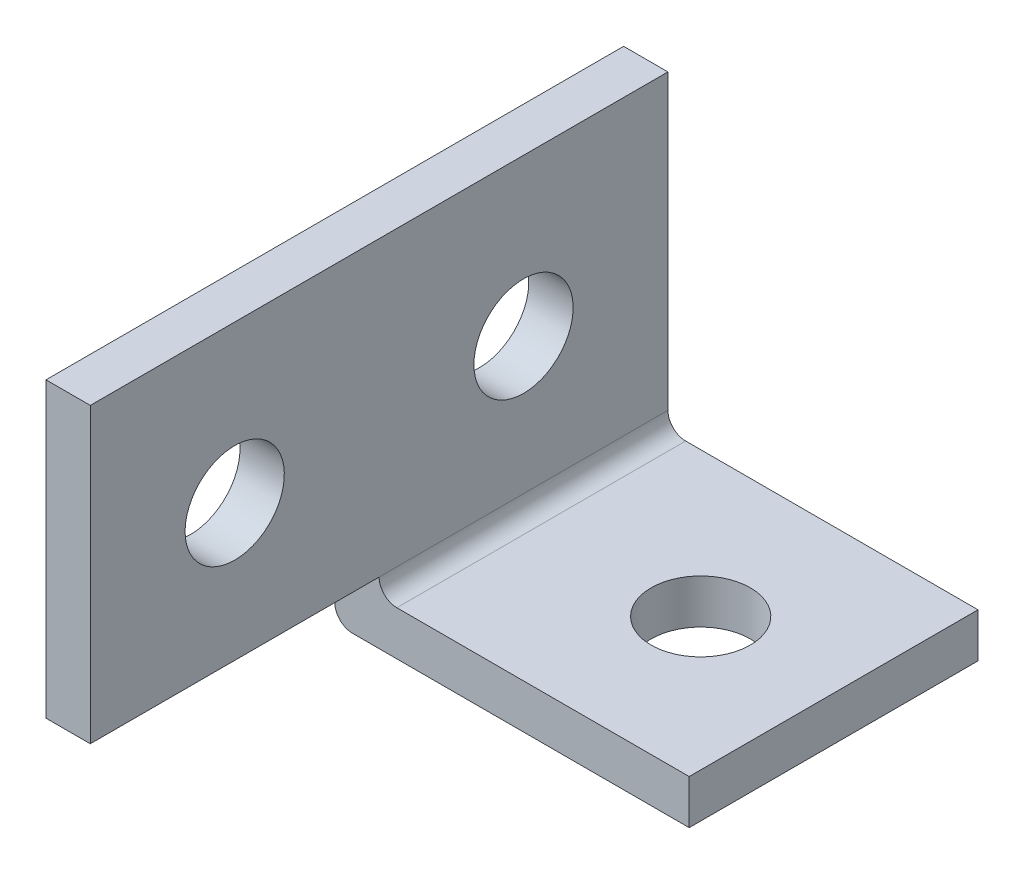
ISO-10303-21;
HEADER;
FILE_DESCRIPTION(('STEP AP214'),'2;1');
FILE_NAME('part.step','',(''),(''),'','','');
FILE_SCHEMA(('AUTOMOTIVE_DESIGN { 1 0 10303 214 1 1 1 1 }'));
ENDSEC;
DATA;
#1=APPLICATION_CONTEXT('core data for automotive mechanical design processes');
#2=APPLICATION_PROTOCOL_DEFINITION('international standard','automotive_design',2000,#1);
#3=PRODUCT_CONTEXT('',#1,'mechanical');
#4=PRODUCT('Part','Part','',(#3));
#5=PRODUCT_RELATED_PRODUCT_CATEGORY('part','',(#4));
#6=PRODUCT_DEFINITION_FORMATION('','',#4);
#7=PRODUCT_DEFINITION_CONTEXT('part definition',#1,'design');
#8=PRODUCT_DEFINITION('design','',#6,#7);
#9=PRODUCT_DEFINITION_SHAPE('','',#8);
#10=(LENGTH_UNIT() NAMED_UNIT(*) SI_UNIT(.MILLI.,.METRE.));
#11=(NAMED_UNIT(*) PLANE_ANGLE_UNIT() SI_UNIT($,.RADIAN.));
#12=(NAMED_UNIT(*) SI_UNIT($,.STERADIAN.) SOLID_ANGLE_UNIT());
#13=UNCERTAINTY_MEASURE_WITH_UNIT(LENGTH_MEASURE(1.E-05),#10,'distance_accuracy_value','');
#14=(GEOMETRIC_REPRESENTATION_CONTEXT(3) GLOBAL_UNCERTAINTY_ASSIGNED_CONTEXT((#13)) GLOBAL_UNIT_ASSIGNED_CONTEXT((#10,
#11,#12)) REPRESENTATION_CONTEXT('',''));
#15=CARTESIAN_POINT('',(0.,0.,0.));
#16=DIRECTION('',(0.,0.,1.));
#17=DIRECTION('',(1.,0.,0.));
#18=AXIS2_PLACEMENT_3D('',#15,#16,#17);
#19=CARTESIAN_POINT('',(8.89,8.89,41.402));
#20=DIRECTION('',(0.,0.,1.));
#21=DIRECTION('',(1.,0.,0.));
#22=AXIS2_PLACEMENT_3D('',#19,#20,#21);
#23=PLANE('',#22);
#24=CARTESIAN_POINT('',(8.89,8.89,41.402));
#25=DIRECTION('',(0.,0.,-1.));
#26=DIRECTION('',(1.,0.,0.));
#27=AXIS2_PLACEMENT_3D('',#24,#25,#26);
#28=CIRCLE('',#27,2.54);
#29=CARTESIAN_POINT('',(8.89000000000002,6.35,41.402));
#30=VERTEX_POINT('',#29);
#31=CARTESIAN_POINT('',(6.35,8.89000000000002,41.402));
#32=VERTEX_POINT('',#31);
#33=EDGE_CURVE('E114',#30,#32,#28,.T.);
#34=ORIENTED_EDGE('',*,*,#33,.T.);
#35=DIRECTION('',(-1.,0.,0.));
#36=VECTOR('',#35,1.);
#37=CARTESIAN_POINT('',(6.35,8.89000000000002,41.402));
#38=LINE('',#37,#36);
#39=CARTESIAN_POINT('',(0.,8.89000000000002,41.402));
#40=VERTEX_POINT('',#39);
#41=EDGE_CURVE('E36',#32,#40,#38,.T.);
#42=ORIENTED_EDGE('',*,*,#41,.T.);
#43=DIRECTION('',(0.,-1.,0.));
#44=VECTOR('',#43,1.);
#45=CARTESIAN_POINT('',(0.,2.54000000000002,41.402));
#46=LINE('',#45,#44);
#47=CARTESIAN_POINT('',(0.,2.54000000000002,41.402));
#48=VERTEX_POINT('',#47);
#49=EDGE_CURVE('E107',#40,#48,#46,.T.);
#50=ORIENTED_EDGE('',*,*,#49,.T.);
#51=CARTESIAN_POINT('',(2.54,2.54,41.402));
#52=DIRECTION('',(0.,0.,1.));
#53=DIRECTION('',(1.,0.,0.));
#54=AXIS2_PLACEMENT_3D('',#51,#52,#53);
#55=CIRCLE('',#54,2.54);
#56=CARTESIAN_POINT('',(2.54000000000002,0.,41.402));
#57=VERTEX_POINT('',#56);
#58=EDGE_CURVE('E111',#48,#57,#55,.T.);
#59=ORIENTED_EDGE('',*,*,#58,.T.);
#60=DIRECTION('',(1.,0.,0.));
#61=VECTOR('',#60,1.);
#62=CARTESIAN_POINT('',(2.54000000000002,0.,41.402));
#63=LINE('',#62,#61);
#64=CARTESIAN_POINT('',(50.8,0.,41.402));
#65=VERTEX_POINT('',#64);
#66=EDGE_CURVE('E59',#57,#65,#63,.T.);
#67=ORIENTED_EDGE('',*,*,#66,.T.);
#68=DIRECTION('',(0.,1.,0.));
#69=VECTOR('',#68,1.);
#70=CARTESIAN_POINT('',(50.8,0.,41.402));
#71=LINE('',#70,#69);
#72=CARTESIAN_POINT('',(50.8,6.35,41.402));
#73=VERTEX_POINT('',#72);
#74=EDGE_CURVE('E151',#65,#73,#71,.T.);
#75=ORIENTED_EDGE('',*,*,#74,.T.);
#76=DIRECTION('',(-1.,0.,0.));
#77=VECTOR('',#76,1.);
#78=CARTESIAN_POINT('',(50.8,6.35,41.402));
#79=LINE('',#78,#77);
#80=EDGE_CURVE('E100',#73,#30,#79,.T.);
#81=ORIENTED_EDGE('',*,*,#80,.T.);
#82=EDGE_LOOP('',(#34,#42,#50,#59,#67,#75,#81));
#83=FACE_BOUND('',#82,.T.);
#84=ADVANCED_FACE('F32',(#83),#23,.T.);
#85=CARTESIAN_POINT('',(50.8,0.,41.402));
#86=DIRECTION('',(-1.,0.,0.));
#87=DIRECTION('',(0.,0.,1.));
#88=AXIS2_PLACEMENT_3D('',#85,#86,#87);
#89=PLANE('',#88);
#90=DIRECTION('',(0.,1.,0.));
#91=VECTOR('',#90,1.);
#92=CARTESIAN_POINT('',(50.8,0.,0.));
#93=LINE('',#92,#91);
#94=CARTESIAN_POINT('',(50.8,0.,0.));
#95=VERTEX_POINT('',#94);
#96=CARTESIAN_POINT('',(50.8,6.35,0.));
#97=VERTEX_POINT('',#96);
#98=EDGE_CURVE('E135',#95,#97,#93,.T.);
#99=ORIENTED_EDGE('',*,*,#98,.T.);
#100=DIRECTION('',(0.,0.,-1.));
#101=VECTOR('',#100,1.);
#102=CARTESIAN_POINT('',(50.8,6.35,41.402));
#103=LINE('',#102,#101);
#104=EDGE_CURVE('E11',#73,#97,#103,.T.);
#105=ORIENTED_EDGE('',*,*,#104,.F.);
#106=ORIENTED_EDGE('',*,*,#74,.F.);
#107=DIRECTION('',(0.,0.,-1.));
#108=VECTOR('',#107,1.);
#109=CARTESIAN_POINT('',(50.8,0.,41.402));
#110=LINE('',#109,#108);
#111=EDGE_CURVE('E129',#65,#95,#110,.T.);
#112=ORIENTED_EDGE('',*,*,#111,.T.);
#113=EDGE_LOOP('',(#99,#105,#106,#112));
#114=FACE_BOUND('',#113,.T.);
#115=ADVANCED_FACE('F34',(#114),#89,.F.);
#116=CARTESIAN_POINT('',(50.8,6.35,41.402));
#117=DIRECTION('',(0.,-1.,0.));
#118=DIRECTION('',(1.,0.,0.));
#119=AXIS2_PLACEMENT_3D('',#116,#117,#118);
#120=PLANE('',#119);
#121=CARTESIAN_POINT('',(31.75,6.35,20.701));
#122=DIRECTION('',(0.,-1.,0.));
#123=DIRECTION('',(1.,0.,0.));
#124=AXIS2_PLACEMENT_3D('',#121,#122,#123);
#125=CIRCLE('',#124,7.112);
#126=CARTESIAN_POINT('',(31.75,6.35000000000001,13.589));
#127=VERTEX_POINT('',#126);
#128=EDGE_CURVE('E192',#127,#127,#125,.T.);
#129=ORIENTED_EDGE('',*,*,#128,.T.);
#130=EDGE_LOOP('',(#129));
#131=FACE_BOUND('',#130,.T.);
#132=DIRECTION('',(-1.,0.,0.));
#133=VECTOR('',#132,1.);
#134=CARTESIAN_POINT('',(50.8,6.35,0.));
#135=LINE('',#134,#133);
#136=CARTESIAN_POINT('',(8.89000000000002,6.35,0.));
#137=VERTEX_POINT('',#136);
#138=EDGE_CURVE('E138',#97,#137,#135,.T.);
#139=ORIENTED_EDGE('',*,*,#138,.T.);
#140=DIRECTION('',(0.,0.,-1.));
#141=VECTOR('',#140,1.);
#142=CARTESIAN_POINT('',(8.89000000000002,6.35,41.402));
#143=LINE('',#142,#141);
#144=EDGE_CURVE('E42',#30,#137,#143,.T.);
#145=ORIENTED_EDGE('',*,*,#144,.F.);
#146=ORIENTED_EDGE('',*,*,#80,.F.);
#147=ORIENTED_EDGE('',*,*,#104,.T.);
#148=EDGE_LOOP('',(#139,#145,#146,#147));
#149=FACE_BOUND('',#148,.T.);
#150=ADVANCED_FACE('F247',(#131,#149),#120,.F.);
#151=CARTESIAN_POINT('',(8.89,8.89,41.402));
#152=DIRECTION('',(0.,0.,-1.));
#153=DIRECTION('',(-1.,0.,0.));
#154=AXIS2_PLACEMENT_3D('',#151,#152,#153);
#155=CYLINDRICAL_SURFACE('',#154,2.54);
#156=CARTESIAN_POINT('',(8.89,8.89,0.));
#157=DIRECTION('',(0.,0.,-1.));
#158=DIRECTION('',(1.,0.,0.));
#159=AXIS2_PLACEMENT_3D('',#156,#157,#158);
#160=CIRCLE('',#159,2.54);
#161=CARTESIAN_POINT('',(6.35,8.89000000000002,0.));
#162=VERTEX_POINT('',#161);
#163=EDGE_CURVE('E141',#137,#162,#160,.T.);
#164=ORIENTED_EDGE('',*,*,#163,.T.);
#165=DIRECTION('',(0.,0.,-1.));
#166=VECTOR('',#165,1.);
#167=CARTESIAN_POINT('',(6.35,8.89000000000002,41.402));
#168=LINE('',#167,#166);
#169=EDGE_CURVE('E158',#32,#162,#168,.T.);
#170=ORIENTED_EDGE('',*,*,#169,.F.);
#171=ORIENTED_EDGE('',*,*,#33,.F.);
#172=ORIENTED_EDGE('',*,*,#144,.T.);
#173=EDGE_LOOP('',(#164,#170,#171,#172));
#174=FACE_BOUND('',#173,.T.);
#175=ADVANCED_FACE('F207',(#174),#155,.F.);
#176=CARTESIAN_POINT('',(6.35,50.9009802819273,41.402));
#177=DIRECTION('',(-1.,0.,0.));
#178=DIRECTION('',(0.,-1.,0.));
#179=AXIS2_PLACEMENT_3D('',#176,#177,#178);
#180=PLANE('',#179);
#181=CARTESIAN_POINT('',(6.35,28.448,62.103));
#182=DIRECTION('',(-1.,0.,0.));
#183=DIRECTION('',(0.,-1.,0.));
#184=AXIS2_PLACEMENT_3D('',#181,#182,#183);
#185=CIRCLE('',#184,7.11200000000001);
#186=CARTESIAN_POINT('',(6.35,21.336,62.103));
#187=VERTEX_POINT('',#186);
#188=EDGE_CURVE('E164',#187,#187,#185,.T.);
#189=ORIENTED_EDGE('',*,*,#188,.T.);
#190=EDGE_LOOP('',(#189));
#191=FACE_BOUND('',#190,.T.);
#192=CARTESIAN_POINT('',(6.35,28.448,20.701));
#193=DIRECTION('',(-1.,0.,0.));
#194=DIRECTION('',(0.,-1.,0.));
#195=AXIS2_PLACEMENT_3D('',#192,#193,#194);
#196=CIRCLE('',#195,7.112);
#197=CARTESIAN_POINT('',(6.35,21.336,20.701));
#198=VERTEX_POINT('',#197);
#199=EDGE_CURVE('E139',#198,#198,#196,.T.);
#200=ORIENTED_EDGE('',*,*,#199,.T.);
#201=EDGE_LOOP('',(#200));
#202=FACE_BOUND('',#201,.T.);
#203=DIRECTION('',(0.,1.,0.));
#204=VECTOR('',#203,1.);
#205=CARTESIAN_POINT('',(6.35,50.9009802819273,0.));
#206=LINE('',#205,#204);
#207=CARTESIAN_POINT('',(6.35,50.9009802819273,0.));
#208=VERTEX_POINT('',#207);
#209=EDGE_CURVE('E143',#162,#208,#206,.T.);
#210=ORIENTED_EDGE('',*,*,#209,.T.);
#211=DIRECTION('',(0.,0.,-1.));
#212=VECTOR('',#211,1.);
#213=CARTESIAN_POINT('',(6.35,50.9009802819273,41.402));
#214=LINE('',#213,#212);
#215=CARTESIAN_POINT('',(6.35,50.9009802819273,82.804));
#216=VERTEX_POINT('',#215);
#217=EDGE_CURVE('E155',#216,#208,#214,.T.);
#218=ORIENTED_EDGE('',*,*,#217,.F.);
#219=DIRECTION('',(0.,1.,0.));
#220=VECTOR('',#219,1.);
#221=CARTESIAN_POINT('',(6.35,50.9009802819273,82.804));
#222=LINE('',#221,#220);
#223=CARTESIAN_POINT('',(6.35,8.89000000000002,82.804));
#224=VERTEX_POINT('',#223);
#225=EDGE_CURVE('E180',#224,#216,#222,.T.);
#226=ORIENTED_EDGE('',*,*,#225,.F.);
#227=DIRECTION('',(0.,0.,1.));
#228=VECTOR('',#227,1.);
#229=CARTESIAN_POINT('',(6.35,8.89000000000002,82.804));
#230=LINE('',#229,#228);
#231=EDGE_CURVE('E168',#32,#224,#230,.T.);
#232=ORIENTED_EDGE('',*,*,#231,.F.);
#233=ORIENTED_EDGE('',*,*,#169,.T.);
#234=EDGE_LOOP('',(#210,#218,#226,#232,#233));
#235=FACE_BOUND('',#234,.T.);
#236=ADVANCED_FACE('F212',(#191,#202,#235),#180,.F.);
#237=CARTESIAN_POINT('',(0.,50.9009802819273,41.402));
#238=DIRECTION('',(0.,-1.,0.));
#239=DIRECTION('',(0.,0.,-1.));
#240=AXIS2_PLACEMENT_3D('',#237,#238,#239);
#241=PLANE('',#240);
#242=DIRECTION('',(-1.,0.,0.));
#243=VECTOR('',#242,1.);
#244=CARTESIAN_POINT('',(0.,50.9009802819273,0.));
#245=LINE('',#244,#243);
#246=CARTESIAN_POINT('',(0.,50.9009802819273,0.));
#247=VERTEX_POINT('',#246);
#248=EDGE_CURVE('E145',#208,#247,#245,.T.);
#249=ORIENTED_EDGE('',*,*,#248,.T.);
#250=DIRECTION('',(0.,0.,-1.));
#251=VECTOR('',#250,1.);
#252=CARTESIAN_POINT('',(0.,50.9009802819273,41.402));
#253=LINE('',#252,#251);
#254=CARTESIAN_POINT('',(0.,50.9009802819273,82.804));
#255=VERTEX_POINT('',#254);
#256=EDGE_CURVE('E124',#255,#247,#253,.T.);
#257=ORIENTED_EDGE('',*,*,#256,.F.);
#258=DIRECTION('',(-1.,0.,0.));
#259=VECTOR('',#258,1.);
#260=CARTESIAN_POINT('',(6.35,50.9009802819273,82.804));
#261=LINE('',#260,#259);
#262=EDGE_CURVE('E183',#216,#255,#261,.T.);
#263=ORIENTED_EDGE('',*,*,#262,.F.);
#264=ORIENTED_EDGE('',*,*,#217,.T.);
#265=EDGE_LOOP('',(#249,#257,#263,#264));
#266=FACE_BOUND('',#265,.T.);
#267=ADVANCED_FACE('F221',(#266),#241,.F.);
#268=CARTESIAN_POINT('',(0.,2.54000000000002,41.402));
#269=DIRECTION('',(1.,0.,0.));
#270=DIRECTION('',(0.,0.,-1.));
#271=AXIS2_PLACEMENT_3D('',#268,#269,#270);
#272=PLANE('',#271);
#273=CARTESIAN_POINT('',(0.,28.448,62.103));
#274=DIRECTION('',(-1.,0.,0.));
#275=DIRECTION('',(0.,0.,-1.));
#276=AXIS2_PLACEMENT_3D('',#273,#274,#275);
#277=CIRCLE('',#276,7.11200000000001);
#278=CARTESIAN_POINT('',(0.,28.448,54.991));
#279=VERTEX_POINT('',#278);
#280=EDGE_CURVE('E171',#279,#279,#277,.T.);
#281=ORIENTED_EDGE('',*,*,#280,.F.);
#282=EDGE_LOOP('',(#281));
#283=FACE_BOUND('',#282,.T.);
#284=CARTESIAN_POINT('',(0.,28.448,20.701));
#285=DIRECTION('',(-1.,0.,0.));
#286=DIRECTION('',(0.,0.,1.));
#287=AXIS2_PLACEMENT_3D('',#284,#285,#286);
#288=CIRCLE('',#287,7.112);
#289=CARTESIAN_POINT('',(0.,28.448,27.813));
#290=VERTEX_POINT('',#289);
#291=EDGE_CURVE('E195',#290,#290,#288,.T.);
#292=ORIENTED_EDGE('',*,*,#291,.F.);
#293=EDGE_LOOP('',(#292));
#294=FACE_BOUND('',#293,.T.);
#295=DIRECTION('',(0.,-1.,0.));
#296=VECTOR('',#295,1.);
#297=CARTESIAN_POINT('',(0.,2.54000000000002,0.));
#298=LINE('',#297,#296);
#299=CARTESIAN_POINT('',(0.,2.54000000000002,0.));
#300=VERTEX_POINT('',#299);
#301=EDGE_CURVE('E121',#247,#300,#298,.T.);
#302=ORIENTED_EDGE('',*,*,#301,.T.);
#303=DIRECTION('',(0.,0.,-1.));
#304=VECTOR('',#303,1.);
#305=CARTESIAN_POINT('',(0.,2.54000000000002,41.402));
#306=LINE('',#305,#304);
#307=EDGE_CURVE('E117',#48,#300,#306,.T.);
#308=ORIENTED_EDGE('',*,*,#307,.F.);
#309=ORIENTED_EDGE('',*,*,#49,.F.);
#310=DIRECTION('',(0.,0.,1.));
#311=VECTOR('',#310,1.);
#312=CARTESIAN_POINT('',(0.,8.89000000000002,82.804));
#313=LINE('',#312,#311);
#314=CARTESIAN_POINT('',(0.,8.89000000000002,82.804));
#315=VERTEX_POINT('',#314);
#316=EDGE_CURVE('E50',#40,#315,#313,.T.);
#317=ORIENTED_EDGE('',*,*,#316,.T.);
#318=DIRECTION('',(0.,1.,0.));
#319=VECTOR('',#318,1.);
#320=CARTESIAN_POINT('',(0.,50.9009802819273,82.804));
#321=LINE('',#320,#319);
#322=EDGE_CURVE('E163',#315,#255,#321,.T.);
#323=ORIENTED_EDGE('',*,*,#322,.T.);
#324=ORIENTED_EDGE('',*,*,#256,.T.);
#325=EDGE_LOOP('',(#302,#308,#309,#317,#323,#324));
#326=FACE_BOUND('',#325,.T.);
#327=ADVANCED_FACE('F118',(#283,#294,#326),#272,.F.);
#328=CARTESIAN_POINT('',(2.54,2.54,41.402));
#329=DIRECTION('',(0.,0.,-1.));
#330=DIRECTION('',(-1.,0.,0.));
#331=AXIS2_PLACEMENT_3D('',#328,#329,#330);
#332=CYLINDRICAL_SURFACE('',#331,2.54);
#333=CARTESIAN_POINT('',(2.54,2.54,0.));
#334=DIRECTION('',(0.,0.,1.));
#335=DIRECTION('',(1.,0.,0.));
#336=AXIS2_PLACEMENT_3D('',#333,#334,#335);
#337=CIRCLE('',#336,2.54);
#338=CARTESIAN_POINT('',(2.54000000000002,0.,0.));
#339=VERTEX_POINT('',#338);
#340=EDGE_CURVE('E148',#300,#339,#337,.T.);
#341=ORIENTED_EDGE('',*,*,#340,.T.);
#342=DIRECTION('',(0.,0.,-1.));
#343=VECTOR('',#342,1.);
#344=CARTESIAN_POINT('',(2.54000000000002,0.,41.402));
#345=LINE('',#344,#343);
#346=EDGE_CURVE('E125',#57,#339,#345,.T.);
#347=ORIENTED_EDGE('',*,*,#346,.F.);
#348=ORIENTED_EDGE('',*,*,#58,.F.);
#349=ORIENTED_EDGE('',*,*,#307,.T.);
#350=EDGE_LOOP('',(#341,#347,#348,#349));
#351=FACE_BOUND('',#350,.T.);
#352=ADVANCED_FACE('F127',(#351),#332,.T.);
#353=CARTESIAN_POINT('',(2.54000000000002,0.,41.402));
#354=DIRECTION('',(0.,1.,0.));
#355=DIRECTION('',(0.,0.,1.));
#356=AXIS2_PLACEMENT_3D('',#353,#354,#355);
#357=PLANE('',#356);
#358=CARTESIAN_POINT('',(31.75,0.,20.701));
#359=DIRECTION('',(0.,-1.,0.));
#360=DIRECTION('',(0.,0.,-1.));
#361=AXIS2_PLACEMENT_3D('',#358,#359,#360);
#362=CIRCLE('',#361,7.112);
#363=CARTESIAN_POINT('',(31.75,0.,13.589));
#364=VERTEX_POINT('',#363);
#365=EDGE_CURVE('E186',#364,#364,#362,.T.);
#366=ORIENTED_EDGE('',*,*,#365,.F.);
#367=EDGE_LOOP('',(#366));
#368=FACE_BOUND('',#367,.T.);
#369=DIRECTION('',(1.,0.,0.));
#370=VECTOR('',#369,1.);
#371=CARTESIAN_POINT('',(2.54000000000002,0.,0.));
#372=LINE('',#371,#370);
#373=EDGE_CURVE('E92',#339,#95,#372,.T.);
#374=ORIENTED_EDGE('',*,*,#373,.T.);
#375=ORIENTED_EDGE('',*,*,#111,.F.);
#376=ORIENTED_EDGE('',*,*,#66,.F.);
#377=ORIENTED_EDGE('',*,*,#346,.T.);
#378=EDGE_LOOP('',(#374,#375,#376,#377));
#379=FACE_BOUND('',#378,.T.);
#380=ADVANCED_FACE('F254',(#368,#379),#357,.F.);
#381=CARTESIAN_POINT('',(8.89,8.89,0.));
#382=DIRECTION('',(0.,0.,1.));
#383=DIRECTION('',(1.,0.,0.));
#384=AXIS2_PLACEMENT_3D('',#381,#382,#383);
#385=PLANE('',#384);
#386=ORIENTED_EDGE('',*,*,#98,.F.);
#387=ORIENTED_EDGE('',*,*,#373,.F.);
#388=ORIENTED_EDGE('',*,*,#340,.F.);
#389=ORIENTED_EDGE('',*,*,#301,.F.);
#390=ORIENTED_EDGE('',*,*,#248,.F.);
#391=ORIENTED_EDGE('',*,*,#209,.F.);
#392=ORIENTED_EDGE('',*,*,#163,.F.);
#393=ORIENTED_EDGE('',*,*,#138,.F.);
#394=EDGE_LOOP('',(#386,#387,#388,#389,#390,#391,#392,#393));
#395=FACE_BOUND('',#394,.T.);
#396=ADVANCED_FACE('F218',(#395),#385,.F.);
#397=CARTESIAN_POINT('',(50.8,28.448,20.701));
#398=DIRECTION('',(-1.,0.,0.));
#399=DIRECTION('',(0.,0.,1.));
#400=AXIS2_PLACEMENT_3D('',#397,#398,#399);
#401=CYLINDRICAL_SURFACE('',#400,7.112);
#402=ORIENTED_EDGE('',*,*,#291,.T.);
#403=EDGE_LOOP('',(#402));
#404=FACE_BOUND('',#403,.T.);
#405=ORIENTED_EDGE('',*,*,#199,.F.);
#406=EDGE_LOOP('',(#405));
#407=FACE_BOUND('',#406,.T.);
#408=ADVANCED_FACE('F251',(#404,#407),#401,.F.);
#409=CARTESIAN_POINT('',(31.75,50.9009802819273,20.701));
#410=DIRECTION('',(0.,-1.,0.));
#411=DIRECTION('',(0.,0.,-1.));
#412=AXIS2_PLACEMENT_3D('',#409,#410,#411);
#413=CYLINDRICAL_SURFACE('',#412,7.112);
#414=CARTESIAN_POINT('',(31.75,0.,13.589));
#415=CARTESIAN_POINT('',(31.75,0.0661458333333341,13.589));
#416=CARTESIAN_POINT('',(31.75,0.132291666666668,13.589));
#417=CARTESIAN_POINT('',(31.75,0.264583333333334,13.589));
#418=CARTESIAN_POINT('',(31.75,0.330729166666666,13.589));
#419=CARTESIAN_POINT('',(31.75,0.463020833333332,13.589));
#420=CARTESIAN_POINT('',(31.75,0.529166666666666,13.589));
#421=CARTESIAN_POINT('',(31.75,0.661458333333334,13.589));
#422=CARTESIAN_POINT('',(31.75,0.727604166666669,13.589));
#423=CARTESIAN_POINT('',(31.75,0.859895833333335,13.589));
#424=CARTESIAN_POINT('',(31.75,0.926041666666666,13.589));
#425=CARTESIAN_POINT('',(31.75,1.05833333333333,13.589));
#426=CARTESIAN_POINT('',(31.75,1.12447916666667,13.589));
#427=CARTESIAN_POINT('',(31.75,1.25677083333333,13.589));
#428=CARTESIAN_POINT('',(31.75,1.32291666666667,13.589));
#429=CARTESIAN_POINT('',(31.75,1.45520833333334,13.589));
#430=CARTESIAN_POINT('',(31.75,1.52135416666667,13.589));
#431=CARTESIAN_POINT('',(31.75,1.65364583333334,13.589));
#432=CARTESIAN_POINT('',(31.75,1.71979166666667,13.589));
#433=CARTESIAN_POINT('',(31.75,1.85208333333334,13.589));
#434=CARTESIAN_POINT('',(31.75,1.91822916666667,13.589));
#435=CARTESIAN_POINT('',(31.75,2.05052083333334,13.589));
#436=CARTESIAN_POINT('',(31.75,2.11666666666667,13.589));
#437=CARTESIAN_POINT('',(31.75,2.24895833333334,13.589));
#438=CARTESIAN_POINT('',(31.75,2.31510416666667,13.589));
#439=CARTESIAN_POINT('',(31.75,2.44739583333334,13.589));
#440=CARTESIAN_POINT('',(31.75,2.51354166666667,13.589));
#441=CARTESIAN_POINT('',(31.75,2.64583333333334,13.589));
#442=CARTESIAN_POINT('',(31.75,2.71197916666667,13.589));
#443=CARTESIAN_POINT('',(31.75,2.84427083333334,13.589));
#444=CARTESIAN_POINT('',(31.75,2.91041666666667,13.589));
#445=CARTESIAN_POINT('',(31.75,3.04270833333334,13.589));
#446=CARTESIAN_POINT('',(31.75,3.10885416666667,13.589));
#447=CARTESIAN_POINT('',(31.75,3.24114583333334,13.589));
#448=CARTESIAN_POINT('',(31.75,3.30729166666667,13.589));
#449=CARTESIAN_POINT('',(31.75,3.43958333333334,13.589));
#450=CARTESIAN_POINT('',(31.75,3.50572916666667,13.589));
#451=CARTESIAN_POINT('',(31.75,3.63802083333334,13.589));
#452=CARTESIAN_POINT('',(31.75,3.70416666666667,13.589));
#453=CARTESIAN_POINT('',(31.75,3.83645833333334,13.589));
#454=CARTESIAN_POINT('',(31.75,3.90260416666667,13.589));
#455=CARTESIAN_POINT('',(31.75,4.03489583333334,13.589));
#456=CARTESIAN_POINT('',(31.75,4.10104166666667,13.589));
#457=CARTESIAN_POINT('',(31.75,4.23333333333334,13.589));
#458=CARTESIAN_POINT('',(31.75,4.29947916666667,13.589));
#459=CARTESIAN_POINT('',(31.75,4.43177083333334,13.589));
#460=CARTESIAN_POINT('',(31.75,4.49791666666667,13.589));
#461=CARTESIAN_POINT('',(31.75,4.63020833333334,13.589));
#462=CARTESIAN_POINT('',(31.75,4.69635416666667,13.589));
#463=CARTESIAN_POINT('',(31.75,4.82864583333334,13.589));
#464=CARTESIAN_POINT('',(31.75,4.89479166666667,13.589));
#465=CARTESIAN_POINT('',(31.75,5.02708333333334,13.589));
#466=CARTESIAN_POINT('',(31.75,5.09322916666667,13.589));
#467=CARTESIAN_POINT('',(31.75,5.22552083333334,13.589));
#468=CARTESIAN_POINT('',(31.75,5.29166666666667,13.589));
#469=CARTESIAN_POINT('',(31.75,5.42395833333334,13.589));
#470=CARTESIAN_POINT('',(31.75,5.49010416666667,13.589));
#471=CARTESIAN_POINT('',(31.75,5.62239583333334,13.589));
#472=CARTESIAN_POINT('',(31.75,5.68854166666667,13.589));
#473=CARTESIAN_POINT('',(31.75,5.82083333333334,13.589));
#474=CARTESIAN_POINT('',(31.75,5.88697916666668,13.589));
#475=CARTESIAN_POINT('',(31.75,6.01927083333334,13.589));
#476=CARTESIAN_POINT('',(31.75,6.08541666666667,13.589));
#477=CARTESIAN_POINT('',(31.75,6.21770833333334,13.589));
#478=CARTESIAN_POINT('',(31.75,6.28385416666667,13.589));
#479=CARTESIAN_POINT('',(31.75,6.35000000000001,13.589));
#480=B_SPLINE_CURVE_WITH_KNOTS('',3,(#414,#415,#416,#417,#418,#419,#420,#421,#422,#423,#424,
#425,#426,#427,#428,#429,#430,#431,#432,#433,#434,#435,#436,#437,#438,#439,#440,#441,#442,#443,
#444,#445,#446,#447,#448,#449,#450,#451,#452,#453,#454,#455,#456,#457,#458,#459,#460,#461,#462,
#463,#464,#465,#466,#467,#468,#469,#470,#471,#472,#473,#474,#475,#476,#477,#478,#479),
.UNSPECIFIED.,.F.,.F.,(4,2,2,2,2,2,2,2,2,2,2,2,2,2,2,2,2,2,2,2,2,2,2,2,2,2,2,2,2,2,2,2,4),(0.,
0.198437500000002,0.396874999999998,0.5953125,0.793750000000003,0.992187499999998,1.190625,
1.3890625,1.58750000000001,1.7859375,1.984375,2.18281250000001,2.38125,2.5796875,
2.77812500000001,2.9765625,3.175,3.37343750000001,3.571875,3.7703125,3.96875000000001,4.1671875,
4.365625,4.56406250000001,4.7625,4.96093750000001,5.15937500000001,5.3578125,5.55625000000001,
5.75468750000001,5.95312500000001,6.15156250000001,6.35000000000001),.UNSPECIFIED.);
#481=EDGE_CURVE('BSEAM239',#364,#127,#480,.T.);
#482=ORIENTED_EDGE('',*,*,#365,.T.);
#483=ORIENTED_EDGE('',*,*,#128,.F.);
#484=ORIENTED_EDGE('',*,*,#481,.T.);
#485=ORIENTED_EDGE('',*,*,#481,.F.);
#486=EDGE_LOOP('',(#482,#484,#483,#485));
#487=FACE_BOUND('',#486,.T.);
#488=ADVANCED_FACE('F239',(#487),#413,.F.);
#489=CARTESIAN_POINT('',(6.35,50.9009802819273,82.804));
#490=DIRECTION('',(0.,0.,1.));
#491=DIRECTION('',(1.,0.,0.));
#492=AXIS2_PLACEMENT_3D('',#489,#490,#491);
#493=PLANE('',#492);
#494=ORIENTED_EDGE('',*,*,#322,.F.);
#495=DIRECTION('',(-1.,0.,0.));
#496=VECTOR('',#495,1.);
#497=CARTESIAN_POINT('',(6.35,8.89000000000002,82.804));
#498=LINE('',#497,#496);
#499=EDGE_CURVE('E187',#224,#315,#498,.T.);
#500=ORIENTED_EDGE('',*,*,#499,.F.);
#501=ORIENTED_EDGE('',*,*,#225,.T.);
#502=ORIENTED_EDGE('',*,*,#262,.T.);
#503=EDGE_LOOP('',(#494,#500,#501,#502));
#504=FACE_BOUND('',#503,.T.);
#505=ADVANCED_FACE('F226',(#504),#493,.T.);
#506=CARTESIAN_POINT('',(6.35,8.89000000000002,82.804));
#507=DIRECTION('',(0.,-1.,0.));
#508=DIRECTION('',(0.,0.,-1.));
#509=AXIS2_PLACEMENT_3D('',#506,#507,#508);
#510=PLANE('',#509);
#511=ORIENTED_EDGE('',*,*,#316,.F.);
#512=ORIENTED_EDGE('',*,*,#41,.F.);
#513=ORIENTED_EDGE('',*,*,#231,.T.);
#514=ORIENTED_EDGE('',*,*,#499,.T.);
#515=EDGE_LOOP('',(#511,#512,#513,#514));
#516=FACE_BOUND('',#515,.T.);
#517=ADVANCED_FACE('F229',(#516),#510,.T.);
#518=CARTESIAN_POINT('',(50.8,28.448,62.103));
#519=DIRECTION('',(-1.,0.,0.));
#520=DIRECTION('',(0.,0.,1.));
#521=AXIS2_PLACEMENT_3D('',#518,#519,#520);
#522=CYLINDRICAL_SURFACE('',#521,7.11200000000001);
#523=ORIENTED_EDGE('',*,*,#280,.T.);
#524=EDGE_LOOP('',(#523));
#525=FACE_BOUND('',#524,.T.);
#526=ORIENTED_EDGE('',*,*,#188,.F.);
#527=EDGE_LOOP('',(#526));
#528=FACE_BOUND('',#527,.T.);
#529=ADVANCED_FACE('F231',(#525,#528),#522,.F.);
#530=CLOSED_SHELL('',(#84,#115,#150,#175,#236,#267,#327,#352,#380,#396,#408,#488,#505,#517,#529));
#531=MANIFOLD_SOLID_BREP('B2',#530);
#532=ADVANCED_BREP_SHAPE_REPRESENTATION('',(#18,#531),#14);
#533=SHAPE_DEFINITION_REPRESENTATION(#9,#532);
ENDSEC;
END-ISO-10303-21;
